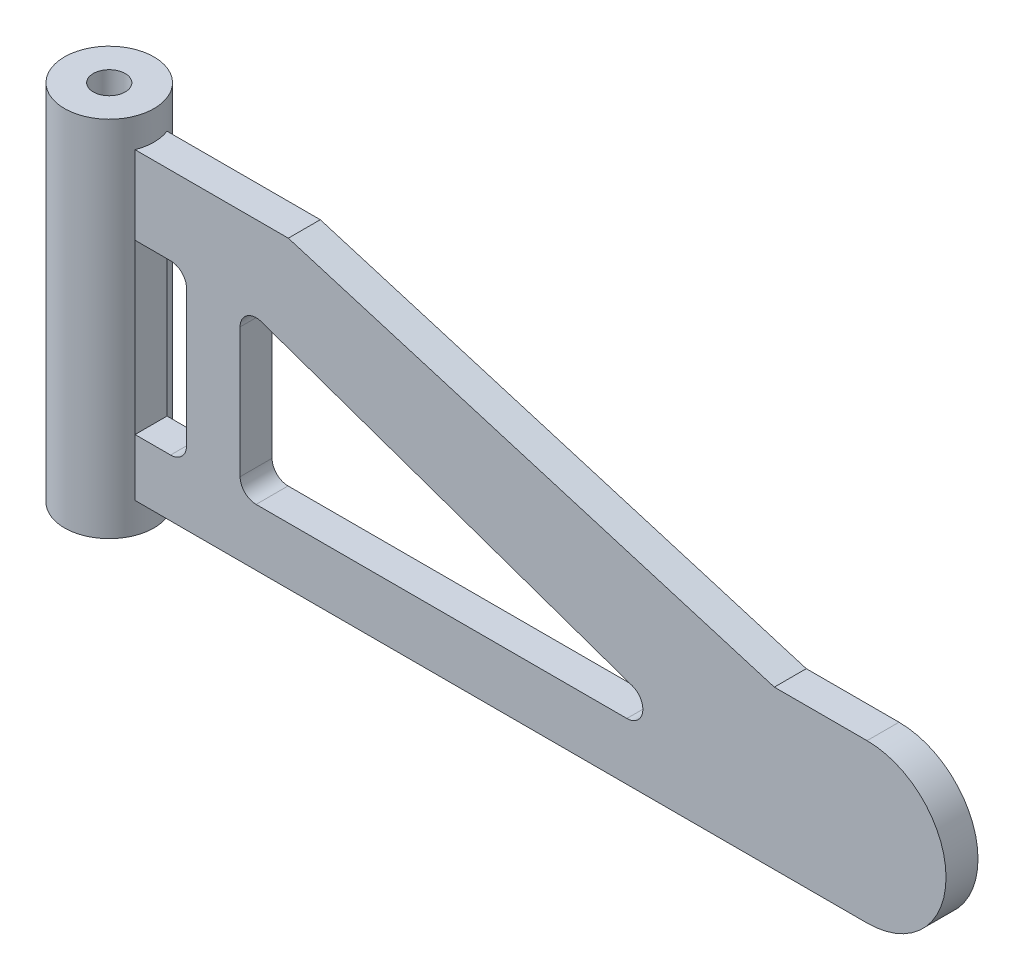
ISO-10303-21;
HEADER;
FILE_DESCRIPTION(('STEP AP214'),'2;1');
FILE_NAME('part.step','',(''),(''),'','','');
FILE_SCHEMA(('AUTOMOTIVE_DESIGN { 1 0 10303 214 1 1 1 1 }'));
ENDSEC;
DATA;
#1=APPLICATION_CONTEXT('core data for automotive mechanical design processes');
#2=APPLICATION_PROTOCOL_DEFINITION('international standard','automotive_design',2000,#1);
#3=PRODUCT_CONTEXT('',#1,'mechanical');
#4=PRODUCT('Part','Part','',(#3));
#5=PRODUCT_RELATED_PRODUCT_CATEGORY('part','',(#4));
#6=PRODUCT_DEFINITION_FORMATION('','',#4);
#7=PRODUCT_DEFINITION_CONTEXT('part definition',#1,'design');
#8=PRODUCT_DEFINITION('design','',#6,#7);
#9=PRODUCT_DEFINITION_SHAPE('','',#8);
#10=(LENGTH_UNIT() NAMED_UNIT(*) SI_UNIT(.MILLI.,.METRE.));
#11=(NAMED_UNIT(*) PLANE_ANGLE_UNIT() SI_UNIT($,.RADIAN.));
#12=(NAMED_UNIT(*) SI_UNIT($,.STERADIAN.) SOLID_ANGLE_UNIT());
#13=UNCERTAINTY_MEASURE_WITH_UNIT(LENGTH_MEASURE(1.E-05),#10,'distance_accuracy_value','');
#14=(GEOMETRIC_REPRESENTATION_CONTEXT(3) GLOBAL_UNCERTAINTY_ASSIGNED_CONTEXT((#13)) GLOBAL_UNIT_ASSIGNED_CONTEXT((#10,
#11,#12)) REPRESENTATION_CONTEXT('',''));
#15=CARTESIAN_POINT('',(0.,0.,0.));
#16=DIRECTION('',(0.,0.,1.));
#17=DIRECTION('',(1.,0.,0.));
#18=AXIS2_PLACEMENT_3D('',#15,#16,#17);
#19=CARTESIAN_POINT('',(-104.637493625701,-55.1415094339623,10.));
#20=DIRECTION('',(0.,1.,0.));
#21=DIRECTION('',(0.,0.,1.));
#22=AXIS2_PLACEMENT_3D('',#19,#20,#21);
#23=PLANE('',#22);
#24=CARTESIAN_POINT('',(-90.637493625701,-55.1415094339623,5.));
#25=DIRECTION('',(0.,-1.,0.));
#26=DIRECTION('',(0.,0.,-1.));
#27=AXIS2_PLACEMENT_3D('',#24,#25,#26);
#28=CIRCLE('',#27,14.);
#29=CARTESIAN_POINT('',(-103.714190456323,-55.1415094339623,9.99999999999999));
#30=VERTEX_POINT('',#29);
#31=CARTESIAN_POINT('',(-104.637493625701,-55.1415094339623,5.));
#32=VERTEX_POINT('',#31);
#33=EDGE_CURVE('E351',#30,#32,#28,.T.);
#34=ORIENTED_EDGE('',*,*,#33,.F.);
#35=DIRECTION('',(1.,0.,0.));
#36=VECTOR('',#35,1.);
#37=CARTESIAN_POINT('',(-104.637493625701,-55.1415094339623,10.));
#38=LINE('',#37,#36);
#39=CARTESIAN_POINT('',(-104.637493625701,-55.1415094339623,10.));
#40=VERTEX_POINT('',#39);
#41=EDGE_CURVE('E246',#40,#30,#38,.T.);
#42=ORIENTED_EDGE('',*,*,#41,.F.);
#43=DIRECTION('',(0.,0.,-1.));
#44=VECTOR('',#43,1.);
#45=CARTESIAN_POINT('',(-104.637493625701,-55.1415094339623,10.));
#46=LINE('',#45,#44);
#47=EDGE_CURVE('E284',#40,#32,#46,.T.);
#48=ORIENTED_EDGE('',*,*,#47,.T.);
#49=EDGE_LOOP('',(#34,#42,#48));
#50=FACE_BOUND('',#49,.T.);
#51=ADVANCED_FACE('F33',(#50),#23,.F.);
#52=CARTESIAN_POINT('',(-103.714190456323,-55.1415094339623,0.));
#53=VERTEX_POINT('',#52);
#54=EDGE_CURVE('E347',#32,#53,#28,.T.);
#55=ORIENTED_EDGE('',*,*,#54,.F.);
#56=CARTESIAN_POINT('',(-104.637493625701,-55.1415094339623,0.));
#57=VERTEX_POINT('',#56);
#58=EDGE_CURVE('E283',#32,#57,#46,.T.);
#59=ORIENTED_EDGE('',*,*,#58,.T.);
#60=DIRECTION('',(1.,0.,0.));
#61=VECTOR('',#60,1.);
#62=CARTESIAN_POINT('',(-104.637493625701,-55.1415094339623,0.));
#63=LINE('',#62,#61);
#64=EDGE_CURVE('E263',#57,#53,#63,.T.);
#65=ORIENTED_EDGE('',*,*,#64,.T.);
#66=EDGE_LOOP('',(#55,#59,#65));
#67=FACE_BOUND('',#66,.T.);
#68=ADVANCED_FACE('F365',(#67),#23,.F.);
#69=CARTESIAN_POINT('',(-77.560796795079,-55.1415094339623,0.));
#70=VERTEX_POINT('',#69);
#71=CARTESIAN_POINT('',(-77.560796795079,-55.1415094339623,10.));
#72=VERTEX_POINT('',#71);
#73=EDGE_CURVE('E225',#70,#72,#28,.T.);
#74=ORIENTED_EDGE('',*,*,#73,.F.);
#75=CARTESIAN_POINT('',(151.362506374299,-55.1415094339623,0.));
#76=VERTEX_POINT('',#75);
#77=EDGE_CURVE('E262',#70,#76,#63,.T.);
#78=ORIENTED_EDGE('',*,*,#77,.T.);
#79=DIRECTION('',(0.,0.,-1.));
#80=VECTOR('',#79,1.);
#81=CARTESIAN_POINT('',(151.362506374299,-55.1415094339623,10.));
#82=LINE('',#81,#80);
#83=CARTESIAN_POINT('',(151.362506374299,-55.1415094339623,10.));
#84=VERTEX_POINT('',#83);
#85=EDGE_CURVE('E280',#84,#76,#82,.T.);
#86=ORIENTED_EDGE('',*,*,#85,.F.);
#87=EDGE_CURVE('E245',#72,#84,#38,.T.);
#88=ORIENTED_EDGE('',*,*,#87,.F.);
#89=EDGE_LOOP('',(#74,#78,#86,#88));
#90=FACE_BOUND('',#89,.T.);
#91=ADVANCED_FACE('F384',(#90),#23,.F.);
#92=CARTESIAN_POINT('',(-104.637493625701,39.8584905660377,10.));
#93=DIRECTION('',(0.,-1.,0.));
#94=DIRECTION('',(1.,0.,0.));
#95=AXIS2_PLACEMENT_3D('',#92,#93,#94);
#96=PLANE('',#95);
#97=CARTESIAN_POINT('',(-90.637493625701,39.8584905660377,5.));
#98=DIRECTION('',(0.,1.,0.));
#99=DIRECTION('',(-1.,0.,0.));
#100=AXIS2_PLACEMENT_3D('',#97,#98,#99);
#101=CIRCLE('',#100,14.);
#102=CARTESIAN_POINT('',(-77.560796795079,39.8584905660377,10.));
#103=VERTEX_POINT('',#102);
#104=CARTESIAN_POINT('',(-77.560796795079,39.8584905660377,0.));
#105=VERTEX_POINT('',#104);
#106=EDGE_CURVE('E302',#103,#105,#101,.T.);
#107=ORIENTED_EDGE('',*,*,#106,.F.);
#108=DIRECTION('',(-1.,0.,0.));
#109=VECTOR('',#108,1.);
#110=CARTESIAN_POINT('',(-104.637493625701,39.8584905660377,10.));
#111=LINE('',#110,#109);
#112=CARTESIAN_POINT('',(-29.637493625701,39.8584905660377,10.));
#113=VERTEX_POINT('',#112);
#114=EDGE_CURVE('E239',#113,#103,#111,.T.);
#115=ORIENTED_EDGE('',*,*,#114,.F.);
#116=DIRECTION('',(0.,0.,-1.));
#117=VECTOR('',#116,1.);
#118=CARTESIAN_POINT('',(-29.637493625701,39.8584905660377,10.));
#119=LINE('',#118,#117);
#120=CARTESIAN_POINT('',(-29.637493625701,39.8584905660377,0.));
#121=VERTEX_POINT('',#120);
#122=EDGE_CURVE('E255',#113,#121,#119,.T.);
#123=ORIENTED_EDGE('',*,*,#122,.T.);
#124=DIRECTION('',(-1.,0.,0.));
#125=VECTOR('',#124,1.);
#126=CARTESIAN_POINT('',(-104.637493625701,39.8584905660377,0.));
#127=LINE('',#126,#125);
#128=EDGE_CURVE('E256',#121,#105,#127,.T.);
#129=ORIENTED_EDGE('',*,*,#128,.T.);
#130=EDGE_LOOP('',(#107,#115,#123,#129));
#131=FACE_BOUND('',#130,.T.);
#132=ADVANCED_FACE('F390',(#131),#96,.F.);
#133=CARTESIAN_POINT('',(-104.637493625701,39.8584905660377,5.));
#134=VERTEX_POINT('',#133);
#135=CARTESIAN_POINT('',(-103.714190456323,39.8584905660377,10.));
#136=VERTEX_POINT('',#135);
#137=EDGE_CURVE('E232',#134,#136,#101,.T.);
#138=ORIENTED_EDGE('',*,*,#137,.F.);
#139=DIRECTION('',(0.,0.,-1.));
#140=VECTOR('',#139,1.);
#141=CARTESIAN_POINT('',(-104.637493625701,39.8584905660377,10.));
#142=LINE('',#141,#140);
#143=CARTESIAN_POINT('',(-104.637493625701,39.8584905660377,10.));
#144=VERTEX_POINT('',#143);
#145=EDGE_CURVE('E288',#144,#134,#142,.T.);
#146=ORIENTED_EDGE('',*,*,#145,.F.);
#147=EDGE_CURVE('E243',#136,#144,#111,.T.);
#148=ORIENTED_EDGE('',*,*,#147,.F.);
#149=EDGE_LOOP('',(#138,#146,#148));
#150=FACE_BOUND('',#149,.T.);
#151=ADVANCED_FACE('F377',(#150),#96,.F.);
#152=CARTESIAN_POINT('',(151.362506374299,-30.4415094339623,10.));
#153=DIRECTION('',(0.,0.,-1.));
#154=DIRECTION('',(-1.,0.,0.));
#155=AXIS2_PLACEMENT_3D('',#152,#153,#154);
#156=PLANE('',#155);
#157=ORIENTED_EDGE('',*,*,#41,.T.);
#158=DIRECTION('',(0.,1.,0.));
#159=VECTOR('',#158,1.);
#160=CARTESIAN_POINT('',(-103.714190456323,-55.1415094339623,10.));
#161=LINE('',#160,#159);
#162=EDGE_CURVE('E230',#30,#136,#161,.T.);
#163=ORIENTED_EDGE('',*,*,#162,.T.);
#164=ORIENTED_EDGE('',*,*,#147,.T.);
#165=DIRECTION('',(0.,-1.,0.));
#166=VECTOR('',#165,1.);
#167=CARTESIAN_POINT('',(-104.637493625701,39.8584905660377,10.));
#168=LINE('',#167,#166);
#169=EDGE_CURVE('E242',#144,#40,#168,.T.);
#170=ORIENTED_EDGE('',*,*,#169,.T.);
#171=EDGE_LOOP('',(#157,#163,#164,#170));
#172=FACE_BOUND('',#171,.T.);
#173=ADVANCED_FACE('F379',(#172),#156,.F.);
#174=CARTESIAN_POINT('',(151.362506374299,-30.4415094339623,0.));
#175=DIRECTION('',(0.,0.,-1.));
#176=DIRECTION('',(-1.,0.,0.));
#177=AXIS2_PLACEMENT_3D('',#174,#175,#176);
#178=PLANE('',#177);
#179=DIRECTION('',(0.,1.,0.));
#180=VECTOR('',#179,1.);
#181=CARTESIAN_POINT('',(-103.714190456323,-55.1415094339623,0.));
#182=LINE('',#181,#180);
#183=CARTESIAN_POINT('',(-103.714190456323,39.8584905660377,0.));
#184=VERTEX_POINT('',#183);
#185=EDGE_CURVE('E294',#53,#184,#182,.T.);
#186=ORIENTED_EDGE('',*,*,#185,.F.);
#187=ORIENTED_EDGE('',*,*,#64,.F.);
#188=DIRECTION('',(0.,-1.,0.));
#189=VECTOR('',#188,1.);
#190=CARTESIAN_POINT('',(-104.637493625701,39.8584905660377,0.));
#191=LINE('',#190,#189);
#192=CARTESIAN_POINT('',(-104.637493625701,39.8584905660377,0.));
#193=VERTEX_POINT('',#192);
#194=EDGE_CURVE('E259',#193,#57,#191,.T.);
#195=ORIENTED_EDGE('',*,*,#194,.F.);
#196=EDGE_CURVE('E238',#184,#193,#127,.T.);
#197=ORIENTED_EDGE('',*,*,#196,.F.);
#198=EDGE_LOOP('',(#186,#187,#195,#197));
#199=FACE_BOUND('',#198,.T.);
#200=ADVANCED_FACE('F362',(#199),#178,.T.);
#201=EDGE_CURVE('E298',#184,#134,#101,.T.);
#202=ORIENTED_EDGE('',*,*,#201,.F.);
#203=ORIENTED_EDGE('',*,*,#196,.T.);
#204=EDGE_CURVE('E287',#134,#193,#142,.T.);
#205=ORIENTED_EDGE('',*,*,#204,.F.);
#206=EDGE_LOOP('',(#202,#203,#205));
#207=FACE_BOUND('',#206,.T.);
#208=ADVANCED_FACE('F35',(#207),#96,.F.);
#209=CARTESIAN_POINT('',(-104.637493625701,39.8584905660377,10.));
#210=DIRECTION('',(1.,0.,0.));
#211=DIRECTION('',(0.,0.,-1.));
#212=AXIS2_PLACEMENT_3D('',#209,#210,#211);
#213=PLANE('',#212);
#214=ORIENTED_EDGE('',*,*,#194,.T.);
#215=ORIENTED_EDGE('',*,*,#58,.F.);
#216=ORIENTED_EDGE('',*,*,#47,.F.);
#217=ORIENTED_EDGE('',*,*,#169,.F.);
#218=ORIENTED_EDGE('',*,*,#145,.T.);
#219=ORIENTED_EDGE('',*,*,#204,.T.);
#220=EDGE_LOOP('',(#214,#215,#216,#217,#218,#219));
#221=FACE_BOUND('',#220,.T.);
#222=ADVANCED_FACE('F368',(#221),#213,.F.);
#223=CARTESIAN_POINT('',(151.362506374299,-30.4415094339623,10.));
#224=DIRECTION('',(0.,0.,-1.));
#225=DIRECTION('',(-1.,0.,0.));
#226=AXIS2_PLACEMENT_3D('',#223,#224,#225);
#227=CYLINDRICAL_SURFACE('',#226,24.7);
#228=CARTESIAN_POINT('',(151.362506374299,-30.4415094339623,0.));
#229=DIRECTION('',(0.,0.,1.));
#230=DIRECTION('',(-1.,0.,0.));
#231=AXIS2_PLACEMENT_3D('',#228,#229,#230);
#232=CIRCLE('',#231,24.7);
#233=CARTESIAN_POINT('',(151.362506374299,-5.74150943396226,0.));
#234=VERTEX_POINT('',#233);
#235=EDGE_CURVE('E266',#76,#234,#232,.T.);
#236=ORIENTED_EDGE('',*,*,#235,.T.);
#237=DIRECTION('',(0.,0.,-1.));
#238=VECTOR('',#237,1.);
#239=CARTESIAN_POINT('',(151.362506374299,-5.74150943396226,10.));
#240=LINE('',#239,#238);
#241=CARTESIAN_POINT('',(151.362506374299,-5.74150943396226,10.));
#242=VERTEX_POINT('',#241);
#243=EDGE_CURVE('E277',#242,#234,#240,.T.);
#244=ORIENTED_EDGE('',*,*,#243,.F.);
#245=CARTESIAN_POINT('',(151.362506374299,-30.4415094339623,10.));
#246=DIRECTION('',(0.,0.,1.));
#247=DIRECTION('',(-1.,0.,0.));
#248=AXIS2_PLACEMENT_3D('',#245,#246,#247);
#249=CIRCLE('',#248,24.7);
#250=EDGE_CURVE('E249',#84,#242,#249,.T.);
#251=ORIENTED_EDGE('',*,*,#250,.F.);
#252=ORIENTED_EDGE('',*,*,#85,.T.);
#253=EDGE_LOOP('',(#236,#244,#251,#252));
#254=FACE_BOUND('',#253,.T.);
#255=ADVANCED_FACE('F402',(#254),#227,.T.);
#256=CARTESIAN_POINT('',(122.362506374299,-5.74150943396226,10.));
#257=DIRECTION('',(0.,-1.,0.));
#258=DIRECTION('',(0.,0.,-1.));
#259=AXIS2_PLACEMENT_3D('',#256,#257,#258);
#260=PLANE('',#259);
#261=DIRECTION('',(-1.,0.,0.));
#262=VECTOR('',#261,1.);
#263=CARTESIAN_POINT('',(122.362506374299,-5.74150943396226,0.));
#264=LINE('',#263,#262);
#265=CARTESIAN_POINT('',(122.362506374299,-5.74150943396226,0.));
#266=VERTEX_POINT('',#265);
#267=EDGE_CURVE('E268',#234,#266,#264,.T.);
#268=ORIENTED_EDGE('',*,*,#267,.T.);
#269=DIRECTION('',(0.,0.,-1.));
#270=VECTOR('',#269,1.);
#271=CARTESIAN_POINT('',(122.362506374299,-5.74150943396226,10.));
#272=LINE('',#271,#270);
#273=CARTESIAN_POINT('',(122.362506374299,-5.74150943396226,10.));
#274=VERTEX_POINT('',#273);
#275=EDGE_CURVE('E274',#274,#266,#272,.T.);
#276=ORIENTED_EDGE('',*,*,#275,.F.);
#277=DIRECTION('',(-1.,0.,0.));
#278=VECTOR('',#277,1.);
#279=CARTESIAN_POINT('',(122.362506374299,-5.74150943396226,10.));
#280=LINE('',#279,#278);
#281=EDGE_CURVE('E251',#242,#274,#280,.T.);
#282=ORIENTED_EDGE('',*,*,#281,.F.);
#283=ORIENTED_EDGE('',*,*,#243,.T.);
#284=EDGE_LOOP('',(#268,#276,#282,#283));
#285=FACE_BOUND('',#284,.T.);
#286=ADVANCED_FACE('F406',(#285),#260,.F.);
#287=CARTESIAN_POINT('',(-29.637493625701,39.8584905660377,10.));
#288=DIRECTION('',(-0.287347885566345,-0.957826285221151,0.));
#289=DIRECTION('',(0.957826285221151,-0.287347885566345,0.));
#290=AXIS2_PLACEMENT_3D('',#287,#288,#289);
#291=PLANE('',#290);
#292=DIRECTION('',(-0.957826285221151,0.287347885566345,0.));
#293=VECTOR('',#292,1.);
#294=CARTESIAN_POINT('',(-29.637493625701,39.8584905660377,0.));
#295=LINE('',#294,#293);
#296=EDGE_CURVE('E270',#266,#121,#295,.T.);
#297=ORIENTED_EDGE('',*,*,#296,.T.);
#298=ORIENTED_EDGE('',*,*,#122,.F.);
#299=DIRECTION('',(-0.957826285221151,0.287347885566345,0.));
#300=VECTOR('',#299,1.);
#301=CARTESIAN_POINT('',(-29.637493625701,39.8584905660377,10.));
#302=LINE('',#301,#300);
#303=EDGE_CURVE('E253',#274,#113,#302,.T.);
#304=ORIENTED_EDGE('',*,*,#303,.F.);
#305=ORIENTED_EDGE('',*,*,#275,.T.);
#306=EDGE_LOOP('',(#297,#298,#304,#305));
#307=FACE_BOUND('',#306,.T.);
#308=ADVANCED_FACE('F412',(#307),#291,.F.);
#309=DIRECTION('',(-0.943887607927318,0.330266836968604,0.));
#310=VECTOR('',#309,1.);
#311=CARTESIAN_POINT('',(77.8963621686034,-27.5717057533699,10.));
#312=LINE('',#311,#310);
#313=CARTESIAN_POINT('',(77.8963621686034,-27.5717057533699,10.));
#314=VERTEX_POINT('',#313);
#315=CARTESIAN_POINT('',(-38.0620644417002,13.0022168776707,10.));
#316=VERTEX_POINT('',#315);
#317=EDGE_CURVE('E428',#314,#316,#312,.T.);
#318=ORIENTED_EDGE('',*,*,#317,.F.);
#319=CARTESIAN_POINT('',(76.2450279837609,-32.2911437930067,10.));
#320=DIRECTION('',(0.,0.,1.));
#321=DIRECTION('',(-1.,0.,0.));
#322=AXIS2_PLACEMENT_3D('',#319,#320,#321);
#323=CIRCLE('',#322,5.);
#324=CARTESIAN_POINT('',(76.2450279837603,-37.2911437930067,10.));
#325=VERTEX_POINT('',#324);
#326=EDGE_CURVE('E48',#325,#314,#323,.T.);
#327=ORIENTED_EDGE('',*,*,#326,.F.);
#328=DIRECTION('',(1.,0.,0.));
#329=VECTOR('',#328,1.);
#330=CARTESIAN_POINT('',(-39.7133986265432,-37.2911437930067,10.));
#331=LINE('',#330,#329);
#332=CARTESIAN_POINT('',(-39.7133986265432,-37.2911437930067,10.));
#333=VERTEX_POINT('',#332);
#334=EDGE_CURVE('E439',#333,#325,#331,.T.);
#335=ORIENTED_EDGE('',*,*,#334,.F.);
#336=CARTESIAN_POINT('',(-39.7133986265433,-32.2911437930067,10.));
#337=DIRECTION('',(0.,0.,1.));
#338=DIRECTION('',(-1.,0.,0.));
#339=AXIS2_PLACEMENT_3D('',#336,#337,#338);
#340=CIRCLE('',#339,5.);
#341=CARTESIAN_POINT('',(-44.7133986265433,-32.2911437930066,10.));
#342=VERTEX_POINT('',#341);
#343=EDGE_CURVE('E436',#342,#333,#340,.T.);
#344=ORIENTED_EDGE('',*,*,#343,.F.);
#345=DIRECTION('',(0.,-1.,0.));
#346=VECTOR('',#345,1.);
#347=CARTESIAN_POINT('',(-44.7133986265433,8.2827788380341,10.));
#348=LINE('',#347,#346);
#349=CARTESIAN_POINT('',(-44.7133986265433,8.2827788380341,10.));
#350=VERTEX_POINT('',#349);
#351=EDGE_CURVE('E433',#350,#342,#348,.T.);
#352=ORIENTED_EDGE('',*,*,#351,.F.);
#353=CARTESIAN_POINT('',(-39.7133986265433,8.28277883803415,10.));
#354=DIRECTION('',(0.,0.,1.));
#355=DIRECTION('',(-1.,0.,0.));
#356=AXIS2_PLACEMENT_3D('',#353,#354,#355);
#357=CIRCLE('',#356,5.);
#358=EDGE_CURVE('E430',#316,#350,#357,.T.);
#359=ORIENTED_EDGE('',*,*,#358,.F.);
#360=EDGE_LOOP('',(#318,#327,#335,#344,#352,#359));
#361=FACE_BOUND('',#360,.T.);
#362=DIRECTION('',(0.,1.,0.));
#363=VECTOR('',#362,1.);
#364=CARTESIAN_POINT('',(-77.560796795079,-55.1415094339623,10.));
#365=LINE('',#364,#363);
#366=CARTESIAN_POINT('',(-77.560796795079,15.3295226759458,10.));
#367=VERTEX_POINT('',#366);
#368=EDGE_CURVE('E227',#103,#367,#365,.F.);
#369=ORIENTED_EDGE('',*,*,#368,.T.);
#370=DIRECTION('',(-1.,0.,0.));
#371=VECTOR('',#370,1.);
#372=CARTESIAN_POINT('',(-77.560796795079,15.3295226759458,10.));
#373=LINE('',#372,#371);
#374=CARTESIAN_POINT('',(-66.4563379575737,15.3295226759458,10.));
#375=VERTEX_POINT('',#374);
#376=EDGE_CURVE('E200',#375,#367,#373,.T.);
#377=ORIENTED_EDGE('',*,*,#376,.F.);
#378=CARTESIAN_POINT('',(-66.4563379575736,10.3295226759458,10.));
#379=DIRECTION('',(0.,0.,1.));
#380=DIRECTION('',(-1.,0.,0.));
#381=AXIS2_PLACEMENT_3D('',#378,#379,#380);
#382=CIRCLE('',#381,5.);
#383=CARTESIAN_POINT('',(-61.4563379575736,10.3295226759458,10.));
#384=VERTEX_POINT('',#383);
#385=EDGE_CURVE('E417',#384,#375,#382,.T.);
#386=ORIENTED_EDGE('',*,*,#385,.F.);
#387=DIRECTION('',(0.,1.,0.));
#388=VECTOR('',#387,1.);
#389=CARTESIAN_POINT('',(-61.4563379575736,10.3295226759458,10.));
#390=LINE('',#389,#388);
#391=CARTESIAN_POINT('',(-61.4563379575736,-32.2911437930066,10.));
#392=VERTEX_POINT('',#391);
#393=EDGE_CURVE('E420',#392,#384,#390,.T.);
#394=ORIENTED_EDGE('',*,*,#393,.F.);
#395=CARTESIAN_POINT('',(-66.4563379575736,-32.2911437930067,10.));
#396=DIRECTION('',(0.,0.,1.));
#397=DIRECTION('',(1.,0.,0.));
#398=AXIS2_PLACEMENT_3D('',#395,#396,#397);
#399=CIRCLE('',#398,5.);
#400=CARTESIAN_POINT('',(-66.4563379575737,-37.2911437930067,10.));
#401=VERTEX_POINT('',#400);
#402=EDGE_CURVE('E220',#401,#392,#399,.T.);
#403=ORIENTED_EDGE('',*,*,#402,.F.);
#404=DIRECTION('',(1.,0.,0.));
#405=VECTOR('',#404,1.);
#406=CARTESIAN_POINT('',(-77.560796795079,-37.2911437930067,10.));
#407=LINE('',#406,#405);
#408=CARTESIAN_POINT('',(-77.560796795079,-37.2911437930067,10.));
#409=VERTEX_POINT('',#408);
#410=EDGE_CURVE('E193',#409,#401,#407,.T.);
#411=ORIENTED_EDGE('',*,*,#410,.F.);
#412=EDGE_CURVE('E216',#409,#72,#365,.F.);
#413=ORIENTED_EDGE('',*,*,#412,.T.);
#414=ORIENTED_EDGE('',*,*,#87,.T.);
#415=ORIENTED_EDGE('',*,*,#250,.T.);
#416=ORIENTED_EDGE('',*,*,#281,.T.);
#417=ORIENTED_EDGE('',*,*,#303,.T.);
#418=ORIENTED_EDGE('',*,*,#114,.T.);
#419=EDGE_LOOP('',(#369,#377,#386,#394,#403,#411,#413,#414,#415,#416,#417,#418));
#420=FACE_BOUND('',#419,.T.);
#421=ADVANCED_FACE('F215',(#361,#420),#156,.F.);
#422=DIRECTION('',(1.,0.,0.));
#423=VECTOR('',#422,1.);
#424=CARTESIAN_POINT('',(151.362506374299,15.3295226759458,0.));
#425=LINE('',#424,#423);
#426=CARTESIAN_POINT('',(-77.560796795079,15.3295226759458,0.));
#427=VERTEX_POINT('',#426);
#428=CARTESIAN_POINT('',(-66.4563379575737,15.3295226759458,0.));
#429=VERTEX_POINT('',#428);
#430=EDGE_CURVE('E332',#427,#429,#425,.T.);
#431=ORIENTED_EDGE('',*,*,#430,.F.);
#432=DIRECTION('',(0.,1.,0.));
#433=VECTOR('',#432,1.);
#434=CARTESIAN_POINT('',(-77.560796795079,-55.1415094339623,0.));
#435=LINE('',#434,#433);
#436=EDGE_CURVE('E291',#105,#427,#435,.F.);
#437=ORIENTED_EDGE('',*,*,#436,.F.);
#438=ORIENTED_EDGE('',*,*,#128,.F.);
#439=ORIENTED_EDGE('',*,*,#296,.F.);
#440=ORIENTED_EDGE('',*,*,#267,.F.);
#441=ORIENTED_EDGE('',*,*,#235,.F.);
#442=ORIENTED_EDGE('',*,*,#77,.F.);
#443=CARTESIAN_POINT('',(-77.560796795079,-37.2911437930067,0.));
#444=VERTEX_POINT('',#443);
#445=EDGE_CURVE('E290',#444,#70,#435,.F.);
#446=ORIENTED_EDGE('',*,*,#445,.F.);
#447=DIRECTION('',(-1.,0.,0.));
#448=VECTOR('',#447,1.);
#449=CARTESIAN_POINT('',(151.362506374299,-37.2911437930067,0.));
#450=LINE('',#449,#448);
#451=CARTESIAN_POINT('',(-66.4563379575737,-37.2911437930067,0.));
#452=VERTEX_POINT('',#451);
#453=EDGE_CURVE('E196',#452,#444,#450,.T.);
#454=ORIENTED_EDGE('',*,*,#453,.F.);
#455=CARTESIAN_POINT('',(-66.4563379575736,-32.2911437930067,0.));
#456=DIRECTION('',(0.,0.,-1.));
#457=DIRECTION('',(-1.,0.,0.));
#458=AXIS2_PLACEMENT_3D('',#455,#456,#457);
#459=CIRCLE('',#458,5.);
#460=CARTESIAN_POINT('',(-61.4563379575736,-32.2911437930066,0.));
#461=VERTEX_POINT('',#460);
#462=EDGE_CURVE('E312',#461,#452,#459,.T.);
#463=ORIENTED_EDGE('',*,*,#462,.F.);
#464=DIRECTION('',(0.,-1.,0.));
#465=VECTOR('',#464,1.);
#466=CARTESIAN_POINT('',(-61.4563379575736,-30.4415094339623,0.));
#467=LINE('',#466,#465);
#468=CARTESIAN_POINT('',(-61.4563379575736,10.3295226759458,0.));
#469=VERTEX_POINT('',#468);
#470=EDGE_CURVE('E41',#469,#461,#467,.T.);
#471=ORIENTED_EDGE('',*,*,#470,.F.);
#472=CARTESIAN_POINT('',(-66.4563379575736,10.3295226759458,0.));
#473=DIRECTION('',(0.,0.,-1.));
#474=DIRECTION('',(-1.,0.,0.));
#475=AXIS2_PLACEMENT_3D('',#472,#473,#474);
#476=CIRCLE('',#475,5.);
#477=EDGE_CURVE('E11',#429,#469,#476,.T.);
#478=ORIENTED_EDGE('',*,*,#477,.F.);
#479=EDGE_LOOP('',(#431,#437,#438,#439,#440,#441,#442,#446,#454,#463,#471,#478));
#480=FACE_BOUND('',#479,.T.);
#481=CARTESIAN_POINT('',(76.2450279837609,-32.2911437930067,0.));
#482=DIRECTION('',(0.,0.,-1.));
#483=DIRECTION('',(-1.,0.,0.));
#484=AXIS2_PLACEMENT_3D('',#481,#482,#483);
#485=CIRCLE('',#484,5.);
#486=CARTESIAN_POINT('',(77.8963621686034,-27.5717057533699,0.));
#487=VERTEX_POINT('',#486);
#488=CARTESIAN_POINT('',(76.2450279837603,-37.2911437930067,0.));
#489=VERTEX_POINT('',#488);
#490=EDGE_CURVE('E310',#487,#489,#485,.T.);
#491=ORIENTED_EDGE('',*,*,#490,.F.);
#492=DIRECTION('',(0.943887607927318,-0.330266836968604,0.));
#493=VECTOR('',#492,1.);
#494=CARTESIAN_POINT('',(144.243717344314,-50.7866849003384,0.));
#495=LINE('',#494,#493);
#496=CARTESIAN_POINT('',(-38.0620644417002,13.0022168776707,0.));
#497=VERTEX_POINT('',#496);
#498=EDGE_CURVE('E299',#497,#487,#495,.T.);
#499=ORIENTED_EDGE('',*,*,#498,.F.);
#500=CARTESIAN_POINT('',(-39.7133986265433,8.28277883803415,0.));
#501=DIRECTION('',(0.,0.,-1.));
#502=DIRECTION('',(-1.,0.,0.));
#503=AXIS2_PLACEMENT_3D('',#500,#501,#502);
#504=CIRCLE('',#503,5.);
#505=CARTESIAN_POINT('',(-44.7133986265433,8.2827788380341,0.));
#506=VERTEX_POINT('',#505);
#507=EDGE_CURVE('E301',#506,#497,#504,.T.);
#508=ORIENTED_EDGE('',*,*,#507,.F.);
#509=DIRECTION('',(0.,1.,0.));
#510=VECTOR('',#509,1.);
#511=CARTESIAN_POINT('',(-44.7133986265433,-30.4415094339623,0.));
#512=LINE('',#511,#510);
#513=CARTESIAN_POINT('',(-44.7133986265433,-32.2911437930066,0.));
#514=VERTEX_POINT('',#513);
#515=EDGE_CURVE('E304',#514,#506,#512,.T.);
#516=ORIENTED_EDGE('',*,*,#515,.F.);
#517=CARTESIAN_POINT('',(-39.7133986265433,-32.2911437930067,0.));
#518=DIRECTION('',(0.,0.,-1.));
#519=DIRECTION('',(-1.,0.,0.));
#520=AXIS2_PLACEMENT_3D('',#517,#518,#519);
#521=CIRCLE('',#520,5.);
#522=CARTESIAN_POINT('',(-39.7133986265432,-37.2911437930067,0.));
#523=VERTEX_POINT('',#522);
#524=EDGE_CURVE('E306',#523,#514,#521,.T.);
#525=ORIENTED_EDGE('',*,*,#524,.F.);
#526=DIRECTION('',(-1.,0.,0.));
#527=VECTOR('',#526,1.);
#528=CARTESIAN_POINT('',(151.362506374299,-37.2911437930067,0.));
#529=LINE('',#528,#527);
#530=EDGE_CURVE('E308',#489,#523,#529,.T.);
#531=ORIENTED_EDGE('',*,*,#530,.F.);
#532=EDGE_LOOP('',(#491,#499,#508,#516,#525,#531));
#533=FACE_BOUND('',#532,.T.);
#534=ADVANCED_FACE('F328',(#480,#533),#178,.T.);
#535=CARTESIAN_POINT('',(-90.637493625701,-55.1415094339623,5.));
#536=DIRECTION('',(0.,1.,0.));
#537=DIRECTION('',(-1.,0.,0.));
#538=AXIS2_PLACEMENT_3D('',#535,#536,#537);
#539=CYLINDRICAL_SURFACE('',#538,14.);
#540=ORIENTED_EDGE('',*,*,#73,.T.);
#541=ORIENTED_EDGE('',*,*,#412,.F.);
#542=DIRECTION('',(0.,-1.,0.));
#543=VECTOR('',#542,1.);
#544=CARTESIAN_POINT('',(-77.560796795079,15.3295226759458,10.));
#545=LINE('',#544,#543);
#546=EDGE_CURVE('E204',#367,#409,#545,.T.);
#547=ORIENTED_EDGE('',*,*,#546,.F.);
#548=ORIENTED_EDGE('',*,*,#368,.F.);
#549=ORIENTED_EDGE('',*,*,#106,.T.);
#550=ORIENTED_EDGE('',*,*,#436,.T.);
#551=EDGE_CURVE('E295',#427,#444,#435,.F.);
#552=ORIENTED_EDGE('',*,*,#551,.T.);
#553=ORIENTED_EDGE('',*,*,#445,.T.);
#554=EDGE_LOOP('',(#540,#541,#547,#548,#549,#550,#552,#553));
#555=FACE_BOUND('',#554,.T.);
#556=ORIENTED_EDGE('',*,*,#162,.F.);
#557=ORIENTED_EDGE('',*,*,#33,.T.);
#558=ORIENTED_EDGE('',*,*,#54,.T.);
#559=ORIENTED_EDGE('',*,*,#185,.T.);
#560=ORIENTED_EDGE('',*,*,#201,.T.);
#561=ORIENTED_EDGE('',*,*,#137,.T.);
#562=EDGE_LOOP('',(#556,#557,#558,#559,#560,#561));
#563=FACE_BOUND('',#562,.T.);
#564=CARTESIAN_POINT('',(-90.637493625701,48.9584905660377,5.));
#565=DIRECTION('',(0.,1.,0.));
#566=DIRECTION('',(-1.,0.,0.));
#567=AXIS2_PLACEMENT_3D('',#564,#565,#566);
#568=CIRCLE('',#567,14.);
#569=CARTESIAN_POINT('',(-104.637493625701,48.9584905660377,5.));
#570=VERTEX_POINT('',#569);
#571=EDGE_CURVE('E228',#570,#570,#568,.T.);
#572=ORIENTED_EDGE('',*,*,#571,.F.);
#573=EDGE_LOOP('',(#572));
#574=FACE_BOUND('',#573,.T.);
#575=CARTESIAN_POINT('',(-90.637493625701,-64.6415094339623,5.));
#576=DIRECTION('',(0.,-1.,0.));
#577=DIRECTION('',(0.,0.,-1.));
#578=AXIS2_PLACEMENT_3D('',#575,#576,#577);
#579=CIRCLE('',#578,14.);
#580=CARTESIAN_POINT('',(-90.637493625701,-64.6415094339623,-9.));
#581=VERTEX_POINT('',#580);
#582=EDGE_CURVE('E348',#581,#581,#579,.T.);
#583=ORIENTED_EDGE('',*,*,#582,.F.);
#584=EDGE_LOOP('',(#583));
#585=FACE_BOUND('',#584,.T.);
#586=ADVANCED_FACE('F222',(#555,#563,#574,#585),#539,.T.);
#587=CARTESIAN_POINT('',(-90.637493625701,48.9584905660377,5.));
#588=DIRECTION('',(0.,1.,0.));
#589=DIRECTION('',(-1.,0.,0.));
#590=AXIS2_PLACEMENT_3D('',#587,#588,#589);
#591=PLANE('',#590);
#592=CARTESIAN_POINT('',(-90.637493625701,48.9584905660377,5.));
#593=DIRECTION('',(0.,1.,0.));
#594=DIRECTION('',(-1.,0.,0.));
#595=AXIS2_PLACEMENT_3D('',#592,#593,#594);
#596=CIRCLE('',#595,5.);
#597=CARTESIAN_POINT('',(-95.6374936257011,48.9584905660377,5.));
#598=VERTEX_POINT('',#597);
#599=EDGE_CURVE('E344',#598,#598,#596,.T.);
#600=ORIENTED_EDGE('',*,*,#599,.F.);
#601=EDGE_LOOP('',(#600));
#602=FACE_BOUND('',#601,.T.);
#603=ORIENTED_EDGE('',*,*,#571,.T.);
#604=EDGE_LOOP('',(#603));
#605=FACE_BOUND('',#604,.T.);
#606=ADVANCED_FACE('F495',(#602,#605),#591,.T.);
#607=CARTESIAN_POINT('',(-90.637493625701,-64.6415094339623,5.));
#608=DIRECTION('',(0.,-1.,0.));
#609=DIRECTION('',(0.,0.,-1.));
#610=AXIS2_PLACEMENT_3D('',#607,#608,#609);
#611=PLANE('',#610);
#612=CARTESIAN_POINT('',(-90.637493625701,-64.6415094339623,5.));
#613=DIRECTION('',(0.,1.,0.));
#614=DIRECTION('',(-1.,0.,0.));
#615=AXIS2_PLACEMENT_3D('',#612,#613,#614);
#616=CIRCLE('',#615,5.);
#617=CARTESIAN_POINT('',(-95.637493625701,-64.6415094339623,5.));
#618=VERTEX_POINT('',#617);
#619=EDGE_CURVE('E334',#618,#618,#616,.T.);
#620=ORIENTED_EDGE('',*,*,#619,.T.);
#621=EDGE_LOOP('',(#620));
#622=FACE_BOUND('',#621,.T.);
#623=ORIENTED_EDGE('',*,*,#582,.T.);
#624=EDGE_LOOP('',(#623));
#625=FACE_BOUND('',#624,.T.);
#626=ADVANCED_FACE('F491',(#622,#625),#611,.T.);
#627=CARTESIAN_POINT('',(-90.637493625701,-64.6415094339623,5.));
#628=DIRECTION('',(0.,1.,0.));
#629=DIRECTION('',(-1.,0.,0.));
#630=AXIS2_PLACEMENT_3D('',#627,#628,#629);
#631=CYLINDRICAL_SURFACE('',#630,5.);
#632=CARTESIAN_POINT('',(-95.6374936257011,48.9584905660377,5.));
#633=CARTESIAN_POINT('',(-95.6374936257011,47.7751572327044,5.));
#634=CARTESIAN_POINT('',(-95.6374936257011,46.5918238993711,5.));
#635=CARTESIAN_POINT('',(-95.6374936257011,44.2251572327044,5.));
#636=CARTESIAN_POINT('',(-95.6374936257011,43.0418238993711,5.));
#637=CARTESIAN_POINT('',(-95.6374936257011,40.6751572327044,5.));
#638=CARTESIAN_POINT('',(-95.6374936257011,39.4918238993711,5.));
#639=CARTESIAN_POINT('',(-95.6374936257011,37.1251572327044,5.));
#640=CARTESIAN_POINT('',(-95.6374936257011,35.9418238993711,5.));
#641=CARTESIAN_POINT('',(-95.6374936257011,33.5751572327044,5.));
#642=CARTESIAN_POINT('',(-95.6374936257011,32.3918238993711,5.));
#643=CARTESIAN_POINT('',(-95.6374936257011,30.0251572327044,5.));
#644=CARTESIAN_POINT('',(-95.6374936257011,28.8418238993711,5.));
#645=CARTESIAN_POINT('',(-95.6374936257011,26.4751572327044,5.));
#646=CARTESIAN_POINT('',(-95.6374936257011,25.2918238993711,5.));
#647=CARTESIAN_POINT('',(-95.6374936257011,22.9251572327044,5.));
#648=CARTESIAN_POINT('',(-95.6374936257011,21.7418238993711,5.));
#649=CARTESIAN_POINT('',(-95.6374936257011,19.3751572327044,5.));
#650=CARTESIAN_POINT('',(-95.6374936257011,18.1918238993711,5.));
#651=CARTESIAN_POINT('',(-95.6374936257011,15.8251572327044,5.));
#652=CARTESIAN_POINT('',(-95.6374936257011,14.6418238993711,5.));
#653=CARTESIAN_POINT('',(-95.6374936257011,12.2751572327044,5.));
#654=CARTESIAN_POINT('',(-95.637493625701,11.0918238993711,5.));
#655=CARTESIAN_POINT('',(-95.637493625701,8.72515723270439,5.));
#656=CARTESIAN_POINT('',(-95.637493625701,7.54182389937105,5.));
#657=CARTESIAN_POINT('',(-95.637493625701,5.17515723270438,5.));
#658=CARTESIAN_POINT('',(-95.637493625701,3.99182389937105,5.));
#659=CARTESIAN_POINT('',(-95.637493625701,1.62515723270438,5.));
#660=CARTESIAN_POINT('',(-95.637493625701,0.441823899371049,5.));
#661=CARTESIAN_POINT('',(-95.637493625701,-1.92484276729561,5.));
#662=CARTESIAN_POINT('',(-95.637493625701,-3.10817610062894,5.));
#663=CARTESIAN_POINT('',(-95.637493625701,-5.47484276729561,5.));
#664=CARTESIAN_POINT('',(-95.637493625701,-6.65817610062894,5.));
#665=CARTESIAN_POINT('',(-95.637493625701,-9.02484276729561,5.));
#666=CARTESIAN_POINT('',(-95.637493625701,-10.2081761006289,5.));
#667=CARTESIAN_POINT('',(-95.637493625701,-12.5748427672956,5.));
#668=CARTESIAN_POINT('',(-95.637493625701,-13.7581761006289,5.));
#669=CARTESIAN_POINT('',(-95.637493625701,-16.1248427672956,5.));
#670=CARTESIAN_POINT('',(-95.637493625701,-17.3081761006289,5.));
#671=CARTESIAN_POINT('',(-95.637493625701,-19.6748427672956,5.));
#672=CARTESIAN_POINT('',(-95.637493625701,-20.858176100629,5.));
#673=CARTESIAN_POINT('',(-95.637493625701,-23.2248427672956,5.));
#674=CARTESIAN_POINT('',(-95.637493625701,-24.408176100629,5.));
#675=CARTESIAN_POINT('',(-95.637493625701,-26.7748427672956,5.));
#676=CARTESIAN_POINT('',(-95.637493625701,-27.958176100629,5.));
#677=CARTESIAN_POINT('',(-95.637493625701,-30.3248427672956,5.));
#678=CARTESIAN_POINT('',(-95.637493625701,-31.5081761006289,5.));
#679=CARTESIAN_POINT('',(-95.637493625701,-33.8748427672956,5.));
#680=CARTESIAN_POINT('',(-95.637493625701,-35.058176100629,5.));
#681=CARTESIAN_POINT('',(-95.637493625701,-37.4248427672956,5.));
#682=CARTESIAN_POINT('',(-95.637493625701,-38.608176100629,5.));
#683=CARTESIAN_POINT('',(-95.637493625701,-40.9748427672956,5.));
#684=CARTESIAN_POINT('',(-95.637493625701,-42.1581761006289,5.));
#685=CARTESIAN_POINT('',(-95.637493625701,-44.5248427672956,5.));
#686=CARTESIAN_POINT('',(-95.637493625701,-45.708176100629,5.));
#687=CARTESIAN_POINT('',(-95.637493625701,-48.0748427672956,5.));
#688=CARTESIAN_POINT('',(-95.637493625701,-49.258176100629,5.));
#689=CARTESIAN_POINT('',(-95.637493625701,-51.6248427672956,5.));
#690=CARTESIAN_POINT('',(-95.637493625701,-52.808176100629,5.));
#691=CARTESIAN_POINT('',(-95.637493625701,-55.1748427672956,5.));
#692=CARTESIAN_POINT('',(-95.637493625701,-56.358176100629,5.));
#693=CARTESIAN_POINT('',(-95.637493625701,-58.7248427672956,5.));
#694=CARTESIAN_POINT('',(-95.637493625701,-59.908176100629,5.));
#695=CARTESIAN_POINT('',(-95.637493625701,-62.2748427672956,5.));
#696=CARTESIAN_POINT('',(-95.637493625701,-63.458176100629,5.));
#697=CARTESIAN_POINT('',(-95.637493625701,-64.6415094339623,5.));
#698=B_SPLINE_CURVE_WITH_KNOTS('',3,(#632,#633,#634,#635,#636,#637,#638,#639,#640,#641,#642,
#643,#644,#645,#646,#647,#648,#649,#650,#651,#652,#653,#654,#655,#656,#657,#658,#659,#660,#661,
#662,#663,#664,#665,#666,#667,#668,#669,#670,#671,#672,#673,#674,#675,#676,#677,#678,#679,#680,
#681,#682,#683,#684,#685,#686,#687,#688,#689,#690,#691,#692,#693,#694,#695,#696,#697),
.UNSPECIFIED.,.F.,.F.,(4,2,2,2,2,2,2,2,2,2,2,2,2,2,2,2,2,2,2,2,2,2,2,2,2,2,2,2,2,2,2,2,4),(0.,
3.55,7.10000000000001,10.65,14.2,17.75,21.3,24.85,28.4,31.95,35.5,39.05,42.6,46.15,49.7,53.25,
56.8,60.35,63.9,67.45,71.,74.55,78.1,81.65,85.2,88.75,92.3,95.85,99.4,102.95,106.5,110.05,
113.6),.UNSPECIFIED.);
#699=EDGE_CURVE('BSEAM488',#598,#618,#698,.T.);
#700=ORIENTED_EDGE('',*,*,#599,.T.);
#701=ORIENTED_EDGE('',*,*,#619,.F.);
#702=ORIENTED_EDGE('',*,*,#699,.T.);
#703=ORIENTED_EDGE('',*,*,#699,.F.);
#704=EDGE_LOOP('',(#700,#702,#701,#703));
#705=FACE_BOUND('',#704,.T.);
#706=ADVANCED_FACE('F488',(#705),#631,.F.);
#707=CARTESIAN_POINT('',(-77.560796795079,15.3295226759458,-9.5));
#708=DIRECTION('',(-1.,0.,0.));
#709=DIRECTION('',(0.,0.,1.));
#710=AXIS2_PLACEMENT_3D('',#707,#708,#709);
#711=PLANE('',#710);
#712=ORIENTED_EDGE('',*,*,#551,.F.);
#713=DIRECTION('',(0.,0.,1.));
#714=VECTOR('',#713,1.);
#715=CARTESIAN_POINT('',(-77.560796795079,15.3295226759458,-9.5));
#716=LINE('',#715,#714);
#717=EDGE_CURVE('E207',#427,#367,#716,.T.);
#718=ORIENTED_EDGE('',*,*,#717,.T.);
#719=ORIENTED_EDGE('',*,*,#546,.T.);
#720=DIRECTION('',(0.,0.,1.));
#721=VECTOR('',#720,1.);
#722=CARTESIAN_POINT('',(-77.560796795079,-37.2911437930067,-9.5));
#723=LINE('',#722,#721);
#724=EDGE_CURVE('E188',#444,#409,#723,.T.);
#725=ORIENTED_EDGE('',*,*,#724,.F.);
#726=EDGE_LOOP('',(#712,#718,#719,#725));
#727=FACE_BOUND('',#726,.T.);
#728=ADVANCED_FACE('F205',(#727),#711,.F.);
#729=CARTESIAN_POINT('',(-77.560796795079,15.3295226759458,-9.5));
#730=DIRECTION('',(0.,1.,0.));
#731=DIRECTION('',(0.,0.,1.));
#732=AXIS2_PLACEMENT_3D('',#729,#730,#731);
#733=PLANE('',#732);
#734=ORIENTED_EDGE('',*,*,#430,.T.);
#735=DIRECTION('',(0.,0.,1.));
#736=VECTOR('',#735,1.);
#737=CARTESIAN_POINT('',(-66.4563379575737,15.3295226759458,-9.5));
#738=LINE('',#737,#736);
#739=EDGE_CURVE('E336',#429,#375,#738,.T.);
#740=ORIENTED_EDGE('',*,*,#739,.T.);
#741=ORIENTED_EDGE('',*,*,#376,.T.);
#742=ORIENTED_EDGE('',*,*,#717,.F.);
#743=EDGE_LOOP('',(#734,#740,#741,#742));
#744=FACE_BOUND('',#743,.T.);
#745=ADVANCED_FACE('F584',(#744),#733,.F.);
#746=CARTESIAN_POINT('',(-66.4563379575736,10.3295226759458,-9.5));
#747=DIRECTION('',(0.,0.,1.));
#748=DIRECTION('',(1.,0.,0.));
#749=AXIS2_PLACEMENT_3D('',#746,#747,#748);
#750=CYLINDRICAL_SURFACE('',#749,5.);
#751=ORIENTED_EDGE('',*,*,#477,.T.);
#752=DIRECTION('',(0.,0.,1.));
#753=VECTOR('',#752,1.);
#754=CARTESIAN_POINT('',(-61.4563379575736,10.3295226759458,-9.5));
#755=LINE('',#754,#753);
#756=EDGE_CURVE('E320',#469,#384,#755,.T.);
#757=ORIENTED_EDGE('',*,*,#756,.T.);
#758=ORIENTED_EDGE('',*,*,#385,.T.);
#759=ORIENTED_EDGE('',*,*,#739,.F.);
#760=EDGE_LOOP('',(#751,#757,#758,#759));
#761=FACE_BOUND('',#760,.T.);
#762=ADVANCED_FACE('F593',(#761),#750,.F.);
#763=CARTESIAN_POINT('',(-61.4563379575736,10.3295226759458,-9.5));
#764=DIRECTION('',(1.,0.,0.));
#765=DIRECTION('',(0.,0.,-1.));
#766=AXIS2_PLACEMENT_3D('',#763,#764,#765);
#767=PLANE('',#766);
#768=ORIENTED_EDGE('',*,*,#470,.T.);
#769=DIRECTION('',(0.,0.,1.));
#770=VECTOR('',#769,1.);
#771=CARTESIAN_POINT('',(-61.4563379575736,-32.2911437930066,-9.5));
#772=LINE('',#771,#770);
#773=EDGE_CURVE('E319',#461,#392,#772,.T.);
#774=ORIENTED_EDGE('',*,*,#773,.T.);
#775=ORIENTED_EDGE('',*,*,#393,.T.);
#776=ORIENTED_EDGE('',*,*,#756,.F.);
#777=EDGE_LOOP('',(#768,#774,#775,#776));
#778=FACE_BOUND('',#777,.T.);
#779=ADVANCED_FACE('F317',(#778),#767,.F.);
#780=CARTESIAN_POINT('',(-66.4563379575736,-32.2911437930067,-9.5));
#781=DIRECTION('',(0.,0.,1.));
#782=DIRECTION('',(1.,0.,0.));
#783=AXIS2_PLACEMENT_3D('',#780,#781,#782);
#784=CYLINDRICAL_SURFACE('',#783,5.);
#785=ORIENTED_EDGE('',*,*,#462,.T.);
#786=DIRECTION('',(0.,0.,1.));
#787=VECTOR('',#786,1.);
#788=CARTESIAN_POINT('',(-66.4563379575737,-37.2911437930067,-9.5));
#789=LINE('',#788,#787);
#790=EDGE_CURVE('E199',#452,#401,#789,.T.);
#791=ORIENTED_EDGE('',*,*,#790,.T.);
#792=ORIENTED_EDGE('',*,*,#402,.T.);
#793=ORIENTED_EDGE('',*,*,#773,.F.);
#794=EDGE_LOOP('',(#785,#791,#792,#793));
#795=FACE_BOUND('',#794,.T.);
#796=ADVANCED_FACE('F325',(#795),#784,.F.);
#797=CARTESIAN_POINT('',(-77.560796795079,-37.2911437930067,-9.5));
#798=DIRECTION('',(0.,-1.,0.));
#799=DIRECTION('',(0.,0.,-1.));
#800=AXIS2_PLACEMENT_3D('',#797,#798,#799);
#801=PLANE('',#800);
#802=ORIENTED_EDGE('',*,*,#453,.T.);
#803=ORIENTED_EDGE('',*,*,#724,.T.);
#804=ORIENTED_EDGE('',*,*,#410,.T.);
#805=ORIENTED_EDGE('',*,*,#790,.F.);
#806=EDGE_LOOP('',(#802,#803,#804,#805));
#807=FACE_BOUND('',#806,.T.);
#808=ADVANCED_FACE('F190',(#807),#801,.F.);
#809=CARTESIAN_POINT('',(76.2450279837609,-32.2911437930067,-9.5));
#810=DIRECTION('',(0.,0.,1.));
#811=DIRECTION('',(1.,0.,0.));
#812=AXIS2_PLACEMENT_3D('',#809,#810,#811);
#813=CYLINDRICAL_SURFACE('',#812,5.);
#814=ORIENTED_EDGE('',*,*,#490,.T.);
#815=DIRECTION('',(0.,0.,1.));
#816=VECTOR('',#815,1.);
#817=CARTESIAN_POINT('',(76.2450279837603,-37.2911437930067,-9.5));
#818=LINE('',#817,#816);
#819=EDGE_CURVE('E212',#489,#325,#818,.T.);
#820=ORIENTED_EDGE('',*,*,#819,.T.);
#821=ORIENTED_EDGE('',*,*,#326,.T.);
#822=DIRECTION('',(0.,0.,1.));
#823=VECTOR('',#822,1.);
#824=CARTESIAN_POINT('',(77.8963621686034,-27.5717057533699,-9.5));
#825=LINE('',#824,#823);
#826=EDGE_CURVE('E339',#487,#314,#825,.T.);
#827=ORIENTED_EDGE('',*,*,#826,.F.);
#828=EDGE_LOOP('',(#814,#820,#821,#827));
#829=FACE_BOUND('',#828,.T.);
#830=ADVANCED_FACE('F466',(#829),#813,.F.);
#831=CARTESIAN_POINT('',(-39.7133986265432,-37.2911437930067,-9.5));
#832=DIRECTION('',(0.,-1.,0.));
#833=DIRECTION('',(0.,0.,-1.));
#834=AXIS2_PLACEMENT_3D('',#831,#832,#833);
#835=PLANE('',#834);
#836=ORIENTED_EDGE('',*,*,#530,.T.);
#837=DIRECTION('',(0.,0.,1.));
#838=VECTOR('',#837,1.);
#839=CARTESIAN_POINT('',(-39.7133986265432,-37.2911437930067,-9.5));
#840=LINE('',#839,#838);
#841=EDGE_CURVE('E443',#523,#333,#840,.T.);
#842=ORIENTED_EDGE('',*,*,#841,.T.);
#843=ORIENTED_EDGE('',*,*,#334,.T.);
#844=ORIENTED_EDGE('',*,*,#819,.F.);
#845=EDGE_LOOP('',(#836,#842,#843,#844));
#846=FACE_BOUND('',#845,.T.);
#847=ADVANCED_FACE('F468',(#846),#835,.F.);
#848=CARTESIAN_POINT('',(-39.7133986265433,-32.2911437930067,-9.5));
#849=DIRECTION('',(0.,0.,1.));
#850=DIRECTION('',(1.,0.,0.));
#851=AXIS2_PLACEMENT_3D('',#848,#849,#850);
#852=CYLINDRICAL_SURFACE('',#851,5.);
#853=ORIENTED_EDGE('',*,*,#524,.T.);
#854=DIRECTION('',(0.,0.,1.));
#855=VECTOR('',#854,1.);
#856=CARTESIAN_POINT('',(-44.7133986265433,-32.2911437930066,-9.5));
#857=LINE('',#856,#855);
#858=EDGE_CURVE('E445',#514,#342,#857,.T.);
#859=ORIENTED_EDGE('',*,*,#858,.T.);
#860=ORIENTED_EDGE('',*,*,#343,.T.);
#861=ORIENTED_EDGE('',*,*,#841,.F.);
#862=EDGE_LOOP('',(#853,#859,#860,#861));
#863=FACE_BOUND('',#862,.T.);
#864=ADVANCED_FACE('F471',(#863),#852,.F.);
#865=CARTESIAN_POINT('',(-44.7133986265433,8.2827788380341,-9.5));
#866=DIRECTION('',(-1.,0.,0.));
#867=DIRECTION('',(0.,0.,1.));
#868=AXIS2_PLACEMENT_3D('',#865,#866,#867);
#869=PLANE('',#868);
#870=ORIENTED_EDGE('',*,*,#515,.T.);
#871=DIRECTION('',(0.,0.,1.));
#872=VECTOR('',#871,1.);
#873=CARTESIAN_POINT('',(-44.7133986265433,8.2827788380341,-9.5));
#874=LINE('',#873,#872);
#875=EDGE_CURVE('E447',#506,#350,#874,.T.);
#876=ORIENTED_EDGE('',*,*,#875,.T.);
#877=ORIENTED_EDGE('',*,*,#351,.T.);
#878=ORIENTED_EDGE('',*,*,#858,.F.);
#879=EDGE_LOOP('',(#870,#876,#877,#878));
#880=FACE_BOUND('',#879,.T.);
#881=ADVANCED_FACE('F473',(#880),#869,.F.);
#882=CARTESIAN_POINT('',(-39.7133986265433,8.28277883803415,-9.5));
#883=DIRECTION('',(0.,0.,1.));
#884=DIRECTION('',(1.,0.,0.));
#885=AXIS2_PLACEMENT_3D('',#882,#883,#884);
#886=CYLINDRICAL_SURFACE('',#885,5.);
#887=ORIENTED_EDGE('',*,*,#507,.T.);
#888=DIRECTION('',(0.,0.,1.));
#889=VECTOR('',#888,1.);
#890=CARTESIAN_POINT('',(-38.0620644417002,13.0022168776707,-9.5));
#891=LINE('',#890,#889);
#892=EDGE_CURVE('E56',#497,#316,#891,.T.);
#893=ORIENTED_EDGE('',*,*,#892,.T.);
#894=ORIENTED_EDGE('',*,*,#358,.T.);
#895=ORIENTED_EDGE('',*,*,#875,.F.);
#896=EDGE_LOOP('',(#887,#893,#894,#895));
#897=FACE_BOUND('',#896,.T.);
#898=ADVANCED_FACE('F459',(#897),#886,.F.);
#899=CARTESIAN_POINT('',(77.8963621686034,-27.5717057533699,-9.5));
#900=DIRECTION('',(0.330266836968604,0.943887607927318,0.));
#901=DIRECTION('',(-0.943887607927318,0.330266836968604,0.));
#902=AXIS2_PLACEMENT_3D('',#899,#900,#901);
#903=PLANE('',#902);
#904=ORIENTED_EDGE('',*,*,#498,.T.);
#905=ORIENTED_EDGE('',*,*,#826,.T.);
#906=ORIENTED_EDGE('',*,*,#317,.T.);
#907=ORIENTED_EDGE('',*,*,#892,.F.);
#908=EDGE_LOOP('',(#904,#905,#906,#907));
#909=FACE_BOUND('',#908,.T.);
#910=ADVANCED_FACE('F450',(#909),#903,.F.);
#911=CLOSED_SHELL('',(#51,#68,#91,#132,#151,#173,#200,#208,#222,#255,#286,#308,#421,#534,#586,
#606,#626,#706,#728,#745,#762,#779,#796,#808,#830,#847,#864,#881,#898,#910));
#912=MANIFOLD_SOLID_BREP('B2',#911);
#913=ADVANCED_BREP_SHAPE_REPRESENTATION('',(#18,#912),#14);
#914=SHAPE_DEFINITION_REPRESENTATION(#9,#913);
ENDSEC;
END-ISO-10303-21;
